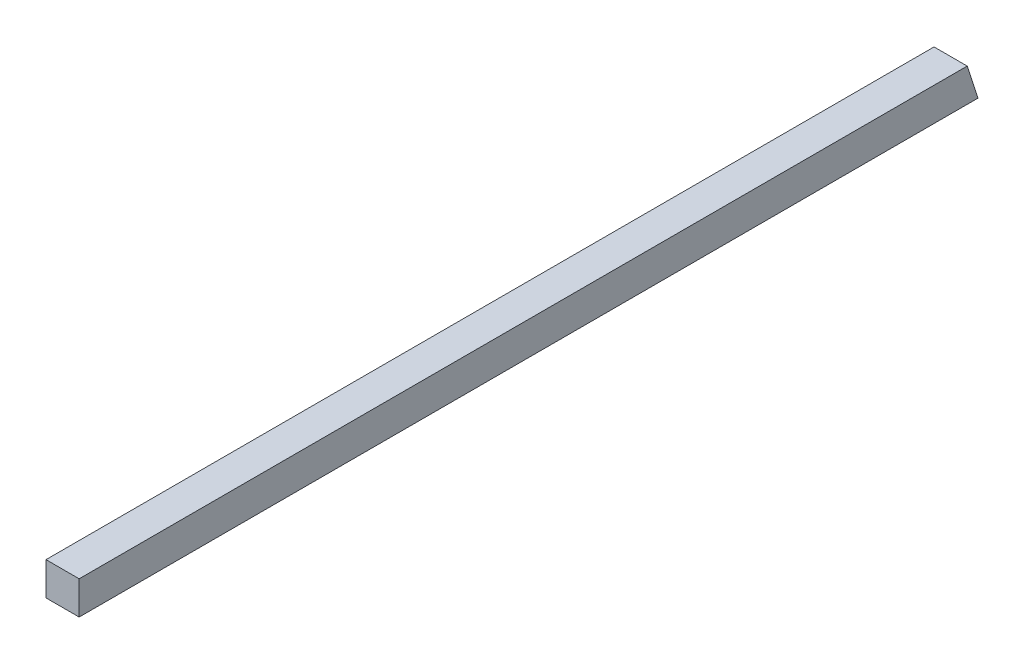
ISO-10303-21;
HEADER;
FILE_DESCRIPTION(('STEP AP214'),'2;1');
FILE_NAME('part.step','',(''),(''),'','','');
FILE_SCHEMA(('AUTOMOTIVE_DESIGN { 1 0 10303 214 1 1 1 1 }'));
ENDSEC;
DATA;
#1=APPLICATION_CONTEXT('core data for automotive mechanical design processes');
#2=APPLICATION_PROTOCOL_DEFINITION('international standard','automotive_design',2000,#1);
#3=PRODUCT_CONTEXT('',#1,'mechanical');
#4=PRODUCT('Part','Part','',(#3));
#5=PRODUCT_RELATED_PRODUCT_CATEGORY('part','',(#4));
#6=PRODUCT_DEFINITION_FORMATION('','',#4);
#7=PRODUCT_DEFINITION_CONTEXT('part definition',#1,'design');
#8=PRODUCT_DEFINITION('design','',#6,#7);
#9=PRODUCT_DEFINITION_SHAPE('','',#8);
#10=(LENGTH_UNIT() NAMED_UNIT(*) SI_UNIT(.MILLI.,.METRE.));
#11=(NAMED_UNIT(*) PLANE_ANGLE_UNIT() SI_UNIT($,.RADIAN.));
#12=(NAMED_UNIT(*) SI_UNIT($,.STERADIAN.) SOLID_ANGLE_UNIT());
#13=UNCERTAINTY_MEASURE_WITH_UNIT(LENGTH_MEASURE(1.E-05),#10,'distance_accuracy_value','');
#14=(GEOMETRIC_REPRESENTATION_CONTEXT(3) GLOBAL_UNCERTAINTY_ASSIGNED_CONTEXT((#13)) GLOBAL_UNIT_ASSIGNED_CONTEXT((#10,
#11,#12)) REPRESENTATION_CONTEXT('',''));
#15=CARTESIAN_POINT('',(0.,0.,0.));
#16=DIRECTION('',(0.,0.,1.));
#17=DIRECTION('',(1.,0.,0.));
#18=AXIS2_PLACEMENT_3D('',#15,#16,#17);
#19=CARTESIAN_POINT('',(3.175,31.75,0.));
#20=DIRECTION('',(-1.,0.,0.));
#21=DIRECTION('',(0.,0.,1.));
#22=AXIS2_PLACEMENT_3D('',#19,#20,#21);
#23=PLANE('',#22);
#24=DIRECTION('',(0.,0.,1.));
#25=VECTOR('',#24,1.);
#26=CARTESIAN_POINT('',(3.175,28.575,0.));
#27=LINE('',#26,#25);
#28=CARTESIAN_POINT('',(3.175,28.575,9.28458031985477));
#29=VERTEX_POINT('',#28);
#30=CARTESIAN_POINT('',(3.175,28.575,10.3162003553939));
#31=VERTEX_POINT('',#30);
#32=EDGE_CURVE('E36',#29,#31,#27,.T.);
#33=ORIENTED_EDGE('',*,*,#32,.T.);
#34=DIRECTION('',(0.,-1.,0.));
#35=VECTOR('',#34,1.);
#36=CARTESIAN_POINT('',(3.175,31.75,10.3162003553939));
#37=LINE('',#36,#35);
#38=CARTESIAN_POINT('',(3.175,3.175,10.3162003553939));
#39=VERTEX_POINT('',#38);
#40=EDGE_CURVE('E114',#31,#39,#37,.T.);
#41=ORIENTED_EDGE('',*,*,#40,.T.);
#42=DIRECTION('',(0.,0.,-1.));
#43=VECTOR('',#42,1.);
#44=CARTESIAN_POINT('',(3.175,3.175,0.));
#45=LINE('',#44,#43);
#46=CARTESIAN_POINT('',(3.175,3.17499999999993,1.03162003554023));
#47=VERTEX_POINT('',#46);
#48=EDGE_CURVE('E99',#39,#47,#45,.T.);
#49=ORIENTED_EDGE('',*,*,#48,.T.);
#50=DIRECTION('',(0.,-0.951056516295172,-0.309016994374891));
#51=VECTOR('',#50,1.);
#52=CARTESIAN_POINT('',(3.175,31.75,10.3162003553939));
#53=LINE('',#52,#51);
#54=EDGE_CURVE('E95',#47,#29,#53,.F.);
#55=ORIENTED_EDGE('',*,*,#54,.T.);
#56=EDGE_LOOP('',(#33,#41,#49,#55));
#57=FACE_BOUND('',#56,.T.);
#58=ADVANCED_FACE('F33',(#57),#23,.F.);
#59=CARTESIAN_POINT('',(31.75,28.575,0.));
#60=DIRECTION('',(0.,1.,0.));
#61=DIRECTION('',(0.,0.,1.));
#62=AXIS2_PLACEMENT_3D('',#59,#60,#61);
#63=PLANE('',#62);
#64=DIRECTION('',(0.,0.,-1.));
#65=VECTOR('',#64,1.);
#66=CARTESIAN_POINT('',(28.575,28.575,0.));
#67=LINE('',#66,#65);
#68=CARTESIAN_POINT('',(28.575,28.575,9.28458031985477));
#69=VERTEX_POINT('',#68);
#70=CARTESIAN_POINT('',(28.575,28.575,10.3162003553939));
#71=VERTEX_POINT('',#70);
#72=EDGE_CURVE('E113',#69,#71,#67,.F.);
#73=ORIENTED_EDGE('',*,*,#72,.T.);
#74=DIRECTION('',(-1.,0.,0.));
#75=VECTOR('',#74,1.);
#76=CARTESIAN_POINT('',(31.75,28.575,10.3162003553939));
#77=LINE('',#76,#75);
#78=EDGE_CURVE('E112',#71,#31,#77,.T.);
#79=ORIENTED_EDGE('',*,*,#78,.T.);
#80=ORIENTED_EDGE('',*,*,#32,.F.);
#81=DIRECTION('',(1.,0.,0.));
#82=VECTOR('',#81,1.);
#83=CARTESIAN_POINT('',(31.75,28.575,9.28458031985468));
#84=LINE('',#83,#82);
#85=EDGE_CURVE('E104',#29,#69,#84,.T.);
#86=ORIENTED_EDGE('',*,*,#85,.T.);
#87=EDGE_LOOP('',(#73,#79,#80,#86));
#88=FACE_BOUND('',#87,.T.);
#89=ADVANCED_FACE('F110',(#88),#63,.F.);
#90=CARTESIAN_POINT('',(28.575,0.,0.));
#91=DIRECTION('',(1.,0.,0.));
#92=DIRECTION('',(0.,0.,-1.));
#93=AXIS2_PLACEMENT_3D('',#90,#91,#92);
#94=PLANE('',#93);
#95=DIRECTION('',(0.,0.,-1.));
#96=VECTOR('',#95,1.);
#97=CARTESIAN_POINT('',(28.575,3.175,0.));
#98=LINE('',#97,#96);
#99=CARTESIAN_POINT('',(28.575,3.17499999999993,1.03162003553997));
#100=VERTEX_POINT('',#99);
#101=CARTESIAN_POINT('',(28.575,3.175,10.3162003553939));
#102=VERTEX_POINT('',#101);
#103=EDGE_CURVE('E126',#100,#102,#98,.F.);
#104=ORIENTED_EDGE('',*,*,#103,.T.);
#105=DIRECTION('',(0.,1.,0.));
#106=VECTOR('',#105,1.);
#107=CARTESIAN_POINT('',(28.575,0.,10.3162003553939));
#108=LINE('',#107,#106);
#109=EDGE_CURVE('E49',#102,#71,#108,.T.);
#110=ORIENTED_EDGE('',*,*,#109,.T.);
#111=ORIENTED_EDGE('',*,*,#72,.F.);
#112=DIRECTION('',(0.,-0.951056516295172,-0.309016994374891));
#113=VECTOR('',#112,1.);
#114=CARTESIAN_POINT('',(28.575,31.75,10.3162003553939));
#115=LINE('',#114,#113);
#116=EDGE_CURVE('E118',#69,#100,#115,.T.);
#117=ORIENTED_EDGE('',*,*,#116,.T.);
#118=EDGE_LOOP('',(#104,#110,#111,#117));
#119=FACE_BOUND('',#118,.T.);
#120=ADVANCED_FACE('F131',(#119),#94,.F.);
#121=CARTESIAN_POINT('',(31.75,31.75,0.));
#122=DIRECTION('',(0.,1.,0.));
#123=DIRECTION('',(0.,0.,1.));
#124=AXIS2_PLACEMENT_3D('',#121,#122,#123);
#125=PLANE('',#124);
#126=DIRECTION('',(1.,0.,0.));
#127=VECTOR('',#126,1.);
#128=CARTESIAN_POINT('',(0.,31.75,860.425));
#129=LINE('',#128,#127);
#130=CARTESIAN_POINT('',(31.75,31.75,860.425));
#131=VERTEX_POINT('',#130);
#132=CARTESIAN_POINT('',(0.,31.75,860.425));
#133=VERTEX_POINT('',#132);
#134=EDGE_CURVE('E153',#131,#133,#129,.F.);
#135=ORIENTED_EDGE('',*,*,#134,.F.);
#136=DIRECTION('',(0.,0.,-1.));
#137=VECTOR('',#136,1.);
#138=CARTESIAN_POINT('',(31.75,31.75,0.));
#139=LINE('',#138,#137);
#140=CARTESIAN_POINT('',(31.75,31.75,10.3162003553939));
#141=VERTEX_POINT('',#140);
#142=EDGE_CURVE('E158',#141,#131,#139,.F.);
#143=ORIENTED_EDGE('',*,*,#142,.F.);
#144=DIRECTION('',(1.,0.,0.));
#145=VECTOR('',#144,1.);
#146=CARTESIAN_POINT('',(31.75,31.75,10.3162003553939));
#147=LINE('',#146,#145);
#148=CARTESIAN_POINT('',(0.,31.75,10.3162003553939));
#149=VERTEX_POINT('',#148);
#150=EDGE_CURVE('E105',#141,#149,#147,.F.);
#151=ORIENTED_EDGE('',*,*,#150,.T.);
#152=DIRECTION('',(0.,0.,1.));
#153=VECTOR('',#152,1.);
#154=CARTESIAN_POINT('',(0.,31.75,0.));
#155=LINE('',#154,#153);
#156=EDGE_CURVE('E146',#133,#149,#155,.F.);
#157=ORIENTED_EDGE('',*,*,#156,.F.);
#158=EDGE_LOOP('',(#135,#143,#151,#157));
#159=FACE_BOUND('',#158,.T.);
#160=ADVANCED_FACE('F184',(#159),#125,.T.);
#161=CARTESIAN_POINT('',(0.,3.175,0.));
#162=DIRECTION('',(0.,-1.,0.));
#163=DIRECTION('',(0.,0.,-1.));
#164=AXIS2_PLACEMENT_3D('',#161,#162,#163);
#165=PLANE('',#164);
#166=ORIENTED_EDGE('',*,*,#48,.F.);
#167=DIRECTION('',(1.,0.,0.));
#168=VECTOR('',#167,1.);
#169=CARTESIAN_POINT('',(0.,3.175,10.3162003553939));
#170=LINE('',#169,#168);
#171=EDGE_CURVE('E133',#39,#102,#170,.T.);
#172=ORIENTED_EDGE('',*,*,#171,.T.);
#173=ORIENTED_EDGE('',*,*,#103,.F.);
#174=DIRECTION('',(1.,0.,0.));
#175=VECTOR('',#174,1.);
#176=CARTESIAN_POINT('',(31.75,3.17499999999974,1.03162003554043));
#177=LINE('',#176,#175);
#178=EDGE_CURVE('E120',#100,#47,#177,.F.);
#179=ORIENTED_EDGE('',*,*,#178,.T.);
#180=EDGE_LOOP('',(#166,#172,#173,#179));
#181=FACE_BOUND('',#180,.T.);
#182=ADVANCED_FACE('F163',(#181),#165,.F.);
#183=CARTESIAN_POINT('',(31.75,31.75,10.3162003553939));
#184=DIRECTION('',(0.,-0.309016994374891,0.951056516295172));
#185=DIRECTION('',(0.,-0.951056516295172,-0.309016994374891));
#186=AXIS2_PLACEMENT_3D('',#183,#184,#185);
#187=PLANE('',#186);
#188=ORIENTED_EDGE('',*,*,#116,.F.);
#189=ORIENTED_EDGE('',*,*,#85,.F.);
#190=ORIENTED_EDGE('',*,*,#54,.F.);
#191=ORIENTED_EDGE('',*,*,#178,.F.);
#192=EDGE_LOOP('',(#188,#189,#190,#191));
#193=FACE_BOUND('',#192,.T.);
#194=ORIENTED_EDGE('',*,*,#150,.F.);
#195=DIRECTION('',(0.,0.951056516295168,0.309016994374903));
#196=VECTOR('',#195,1.);
#197=CARTESIAN_POINT('',(31.75,0.,7.94166764434948E-13));
#198=LINE('',#197,#196);
#199=CARTESIAN_POINT('',(31.75,0.,9.99032428381426E-13));
#200=VERTEX_POINT('',#199);
#201=EDGE_CURVE('E160',#200,#141,#198,.T.);
#202=ORIENTED_EDGE('',*,*,#201,.F.);
#203=DIRECTION('',(1.,0.,0.));
#204=VECTOR('',#203,1.);
#205=CARTESIAN_POINT('',(0.,0.,7.94166764434948E-13));
#206=LINE('',#205,#204);
#207=CARTESIAN_POINT('',(0.,0.,9.99550256141028E-13));
#208=VERTEX_POINT('',#207);
#209=EDGE_CURVE('E143',#208,#200,#206,.T.);
#210=ORIENTED_EDGE('',*,*,#209,.F.);
#211=DIRECTION('',(0.,-0.951056516295168,-0.309016994374903));
#212=VECTOR('',#211,1.);
#213=CARTESIAN_POINT('',(0.,31.75,10.3162003553939));
#214=LINE('',#213,#212);
#215=EDGE_CURVE('E150',#149,#208,#214,.T.);
#216=ORIENTED_EDGE('',*,*,#215,.F.);
#217=EDGE_LOOP('',(#194,#202,#210,#216));
#218=FACE_BOUND('',#217,.T.);
#219=ADVANCED_FACE('F116',(#193,#218),#187,.F.);
#220=CARTESIAN_POINT('',(31.75,0.,0.));
#221=DIRECTION('',(1.,0.,0.));
#222=DIRECTION('',(0.,0.,-1.));
#223=AXIS2_PLACEMENT_3D('',#220,#221,#222);
#224=PLANE('',#223);
#225=ORIENTED_EDGE('',*,*,#201,.T.);
#226=ORIENTED_EDGE('',*,*,#142,.T.);
#227=DIRECTION('',(0.,1.,0.));
#228=VECTOR('',#227,1.);
#229=CARTESIAN_POINT('',(31.75,0.,860.425));
#230=LINE('',#229,#228);
#231=CARTESIAN_POINT('',(31.75,0.,860.425));
#232=VERTEX_POINT('',#231);
#233=EDGE_CURVE('E155',#232,#131,#230,.T.);
#234=ORIENTED_EDGE('',*,*,#233,.F.);
#235=DIRECTION('',(0.,0.,-1.));
#236=VECTOR('',#235,1.);
#237=CARTESIAN_POINT('',(31.75,0.,0.));
#238=LINE('',#237,#236);
#239=EDGE_CURVE('E141',#200,#232,#238,.F.);
#240=ORIENTED_EDGE('',*,*,#239,.F.);
#241=EDGE_LOOP('',(#225,#226,#234,#240));
#242=FACE_BOUND('',#241,.T.);
#243=ADVANCED_FACE('F194',(#242),#224,.T.);
#244=CARTESIAN_POINT('',(0.,0.,860.425));
#245=DIRECTION('',(0.,0.,1.));
#246=DIRECTION('',(1.,0.,0.));
#247=AXIS2_PLACEMENT_3D('',#244,#245,#246);
#248=PLANE('',#247);
#249=ORIENTED_EDGE('',*,*,#134,.T.);
#250=DIRECTION('',(0.,1.,0.));
#251=VECTOR('',#250,1.);
#252=CARTESIAN_POINT('',(0.,31.75,860.425));
#253=LINE('',#252,#251);
#254=CARTESIAN_POINT('',(0.,0.,860.425));
#255=VERTEX_POINT('',#254);
#256=EDGE_CURVE('E58',#255,#133,#253,.T.);
#257=ORIENTED_EDGE('',*,*,#256,.F.);
#258=DIRECTION('',(1.,0.,0.));
#259=VECTOR('',#258,1.);
#260=CARTESIAN_POINT('',(0.,0.,860.425));
#261=LINE('',#260,#259);
#262=EDGE_CURVE('E41',#232,#255,#261,.F.);
#263=ORIENTED_EDGE('',*,*,#262,.F.);
#264=ORIENTED_EDGE('',*,*,#233,.T.);
#265=EDGE_LOOP('',(#249,#257,#263,#264));
#266=FACE_BOUND('',#265,.T.);
#267=ADVANCED_FACE('F197',(#266),#248,.T.);
#268=CARTESIAN_POINT('',(0.,31.75,0.));
#269=DIRECTION('',(-1.,0.,0.));
#270=DIRECTION('',(0.,0.,1.));
#271=AXIS2_PLACEMENT_3D('',#268,#269,#270);
#272=PLANE('',#271);
#273=ORIENTED_EDGE('',*,*,#215,.T.);
#274=DIRECTION('',(0.,0.,-1.));
#275=VECTOR('',#274,1.);
#276=CARTESIAN_POINT('',(0.,0.,0.));
#277=LINE('',#276,#275);
#278=EDGE_CURVE('E11',#255,#208,#277,.T.);
#279=ORIENTED_EDGE('',*,*,#278,.F.);
#280=ORIENTED_EDGE('',*,*,#256,.T.);
#281=ORIENTED_EDGE('',*,*,#156,.T.);
#282=EDGE_LOOP('',(#273,#279,#280,#281));
#283=FACE_BOUND('',#282,.T.);
#284=ADVANCED_FACE('F173',(#283),#272,.T.);
#285=CARTESIAN_POINT('',(0.,0.,0.));
#286=DIRECTION('',(0.,-1.,0.));
#287=DIRECTION('',(0.,0.,-1.));
#288=AXIS2_PLACEMENT_3D('',#285,#286,#287);
#289=PLANE('',#288);
#290=ORIENTED_EDGE('',*,*,#239,.T.);
#291=ORIENTED_EDGE('',*,*,#262,.T.);
#292=ORIENTED_EDGE('',*,*,#278,.T.);
#293=ORIENTED_EDGE('',*,*,#209,.T.);
#294=EDGE_LOOP('',(#290,#291,#292,#293));
#295=FACE_BOUND('',#294,.T.);
#296=ADVANCED_FACE('F168',(#295),#289,.T.);
#297=CARTESIAN_POINT('',(31.75,-850.701495081085,10.3162003553939));
#298=DIRECTION('',(0.,0.,-1.));
#299=DIRECTION('',(-1.,0.,0.));
#300=AXIS2_PLACEMENT_3D('',#297,#298,#299);
#301=PLANE('',#300);
#302=ORIENTED_EDGE('',*,*,#40,.F.);
#303=ORIENTED_EDGE('',*,*,#78,.F.);
#304=ORIENTED_EDGE('',*,*,#109,.F.);
#305=ORIENTED_EDGE('',*,*,#171,.F.);
#306=EDGE_LOOP('',(#302,#303,#304,#305));
#307=FACE_BOUND('',#306,.T.);
#308=ADVANCED_FACE('F165',(#307),#301,.T.);
#309=CLOSED_SHELL('',(#58,#89,#120,#160,#182,#219,#243,#267,#284,#296,#308));
#310=MANIFOLD_SOLID_BREP('B2',#309);
#311=ADVANCED_BREP_SHAPE_REPRESENTATION('',(#18,#310),#14);
#312=SHAPE_DEFINITION_REPRESENTATION(#9,#311);
ENDSEC;
END-ISO-10303-21;
